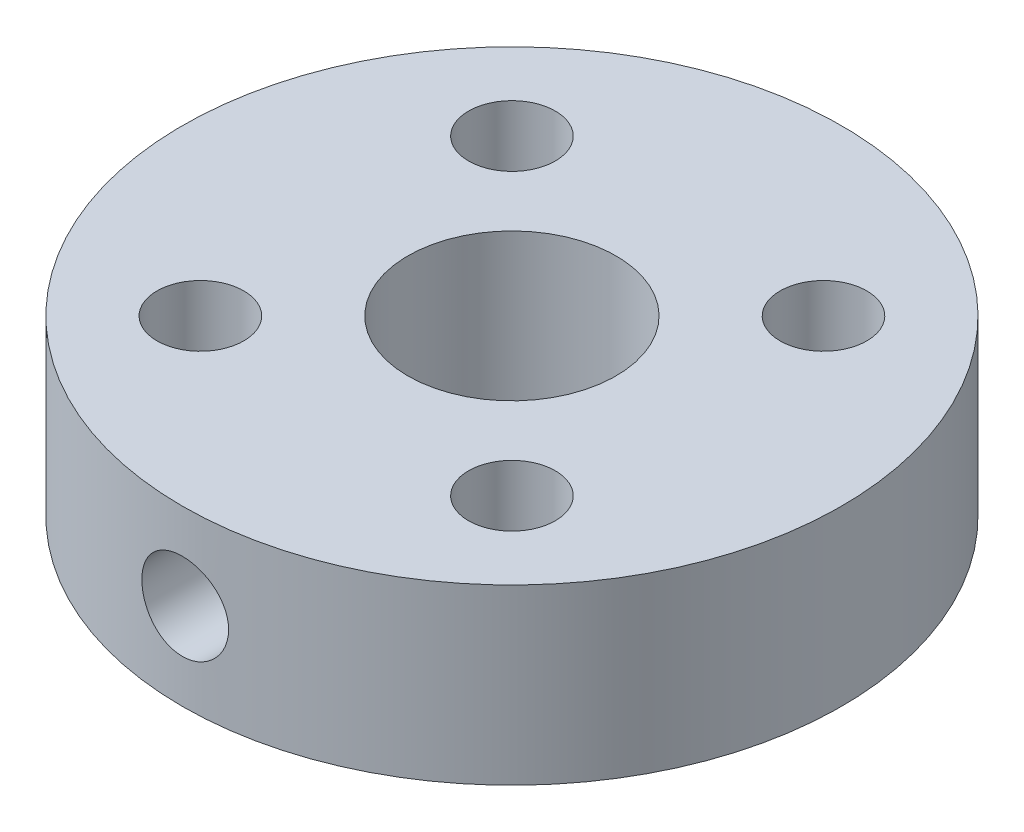
ISO-10303-21;
HEADER;
FILE_DESCRIPTION(('STEP AP214'),'2;1');
FILE_NAME('part.step','',(''),(''),'','','');
FILE_SCHEMA(('AUTOMOTIVE_DESIGN { 1 0 10303 214 1 1 1 1 }'));
ENDSEC;
DATA;
#1=APPLICATION_CONTEXT('core data for automotive mechanical design processes');
#2=APPLICATION_PROTOCOL_DEFINITION('international standard','automotive_design',2000,#1);
#3=PRODUCT_CONTEXT('',#1,'mechanical');
#4=PRODUCT('Part','Part','',(#3));
#5=PRODUCT_RELATED_PRODUCT_CATEGORY('part','',(#4));
#6=PRODUCT_DEFINITION_FORMATION('','',#4);
#7=PRODUCT_DEFINITION_CONTEXT('part definition',#1,'design');
#8=PRODUCT_DEFINITION('design','',#6,#7);
#9=PRODUCT_DEFINITION_SHAPE('','',#8);
#10=(LENGTH_UNIT() NAMED_UNIT(*) SI_UNIT(.MILLI.,.METRE.));
#11=(NAMED_UNIT(*) PLANE_ANGLE_UNIT() SI_UNIT($,.RADIAN.));
#12=(NAMED_UNIT(*) SI_UNIT($,.STERADIAN.) SOLID_ANGLE_UNIT());
#13=UNCERTAINTY_MEASURE_WITH_UNIT(LENGTH_MEASURE(1.E-05),#10,'distance_accuracy_value','');
#14=(GEOMETRIC_REPRESENTATION_CONTEXT(3) GLOBAL_UNCERTAINTY_ASSIGNED_CONTEXT((#13)) GLOBAL_UNIT_ASSIGNED_CONTEXT((#10,
#11,#12)) REPRESENTATION_CONTEXT('',''));
#15=CARTESIAN_POINT('',(0.,0.,0.));
#16=DIRECTION('',(0.,0.,1.));
#17=DIRECTION('',(1.,0.,0.));
#18=AXIS2_PLACEMENT_3D('',#15,#16,#17);
#19=CARTESIAN_POINT('',(0.,4.99999999999995,0.));
#20=DIRECTION('',(0.,-1.,0.));
#21=DIRECTION('',(0.,0.,-1.));
#22=AXIS2_PLACEMENT_3D('',#19,#20,#21);
#23=CYLINDRICAL_SURFACE('',#22,9.5);
#24=CARTESIAN_POINT('',(1.24999999999997,2.5,9.41740410091868));
#25=CARTESIAN_POINT('',(1.24999704789293,2.43011379465121,9.4174051504074));
#26=CARTESIAN_POINT('',(1.24411931466291,2.36018467255551,9.41819043981183));
#27=CARTESIAN_POINT('',(1.22076605843325,2.22227477521104,9.42124533027019));
#28=CARTESIAN_POINT('',(1.20327861458077,2.15429607758199,9.42351645694719));
#29=CARTESIAN_POINT('',(1.15723232174967,2.02230357984595,9.42928142888541));
#30=CARTESIAN_POINT('',(1.12868122804123,1.95828703876495,9.4327744174934));
#31=CARTESIAN_POINT('',(1.06133513403096,1.83596492220372,9.44058851379838));
#32=CARTESIAN_POINT('',(1.02254180069081,1.77765841950908,9.44490948670656));
#33=CARTESIAN_POINT('',(0.935555536447504,1.66803949801497,9.45392261518464));
#34=CARTESIAN_POINT('',(0.887311826136269,1.61676752761641,9.45861669074957));
#35=CARTESIAN_POINT('',(0.782903691497916,1.5230227732687,9.46782988877773));
#36=CARTESIAN_POINT('',(0.726738863459709,1.4805504380781,9.4723490023088));
#37=CARTESIAN_POINT('',(0.607827237142798,1.40546437122737,9.48072286825033));
#38=CARTESIAN_POINT('',(0.545057022732097,1.37288742035891,9.48457511969084));
#39=CARTESIAN_POINT('',(0.414877343359928,1.31875255294749,9.49116007065748));
#40=CARTESIAN_POINT('',(0.347468068548488,1.29719418506968,9.49389281603905));
#41=CARTESIAN_POINT('',(0.210338313470534,1.26582977739812,9.49791731953225));
#42=CARTESIAN_POINT('',(0.140633493799601,1.25595634411634,9.49921733795253));
#43=CARTESIAN_POINT('',(0.000545054460455096,1.24803311553231,9.50025814474572));
#44=CARTESIAN_POINT('',(-0.0698385356542585,1.24998280775381,9.49999900070091));
#45=CARTESIAN_POINT('',(-0.208827747812687,1.26559667926445,9.49795734365727));
#46=CARTESIAN_POINT('',(-0.27744167079201,1.27918837290116,9.49618425701231));
#47=CARTESIAN_POINT('',(-0.41140621434616,1.31758700356627,9.49132449458135));
#48=CARTESIAN_POINT('',(-0.476756767256604,1.34239417303495,9.48823779157078));
#49=CARTESIAN_POINT('',(-0.602562678419433,1.40259594273989,9.48108137373621));
#50=CARTESIAN_POINT('',(-0.663002955821257,1.43802170098401,9.47700877286315));
#51=CARTESIAN_POINT('',(-0.7771081440668,1.51843235628989,9.46833577460664));
#52=CARTESIAN_POINT('',(-0.83077271056404,1.56341773886713,9.4637353504215));
#53=CARTESIAN_POINT('',(-0.930229349088727,1.66207612684239,9.4544799980342));
#54=CARTESIAN_POINT('',(-0.975958735268566,1.71581233424793,9.44982492089108));
#55=CARTESIAN_POINT('',(-1.05775916328449,1.83023047618099,9.44101919770809));
#56=CARTESIAN_POINT('',(-1.09383016863951,1.89091243694236,9.43686855357356));
#57=CARTESIAN_POINT('',(-1.1552946873874,2.01755772705059,9.42954174057464));
#58=CARTESIAN_POINT('',(-1.18068283093794,2.08352369266976,9.4263660620023));
#59=CARTESIAN_POINT('',(-1.22000353371595,2.21883386407501,9.42135807082555));
#60=CARTESIAN_POINT('',(-1.2339367069745,2.28817788857288,9.4195256862159));
#61=CARTESIAN_POINT('',(-1.24986821658869,2.42772111469766,9.41742505133735));
#62=CARTESIAN_POINT('',(-1.25195492887764,2.49791005866257,9.41714521920935));
#63=CARTESIAN_POINT('',(-1.24436778967104,2.63763655644794,9.41815071410228));
#64=CARTESIAN_POINT('',(-1.23469421668084,2.70717412565486,9.41943600405822));
#65=CARTESIAN_POINT('',(-1.20393565087217,2.84335692266045,9.42341633828862));
#66=CARTESIAN_POINT('',(-1.18289375457393,2.91001205346493,9.42610605718739));
#67=CARTESIAN_POINT('',(-1.13004032110585,3.03884829537367,9.43258785218585));
#68=CARTESIAN_POINT('',(-1.0982283671149,3.10102923320545,9.43637997094963));
#69=CARTESIAN_POINT('',(-1.02452177647133,3.21955093973825,9.44466692307175));
#70=CARTESIAN_POINT('',(-0.982569368171561,3.27585549888499,9.44916572917079));
#71=CARTESIAN_POINT('',(-0.889854075114594,3.38065603112867,9.45834681086386));
#72=CARTESIAN_POINT('',(-0.839090809792224,3.42915166676221,9.46302909437602));
#73=CARTESIAN_POINT('',(-0.729807943556192,3.51726989431149,9.47208528996798));
#74=CARTESIAN_POINT('',(-0.67124121478615,3.5568342909582,9.47645705911993));
#75=CARTESIAN_POINT('',(-0.548242056186316,3.62556359939892,9.48436730464791));
#76=CARTESIAN_POINT('',(-0.483809755416936,3.6547287399388,9.48790579935238));
#77=CARTESIAN_POINT('',(-0.35109893942851,3.70173630666023,9.49374132443193));
#78=CARTESIAN_POINT('',(-0.282832344858814,3.71961191690486,9.49604199025898));
#79=CARTESIAN_POINT('',(-0.14423430770835,3.74364082577533,9.4991577737557));
#80=CARTESIAN_POINT('',(-0.0739029690011937,3.74979471307758,9.49997296602722));
#81=CARTESIAN_POINT('',(0.066260830819126,3.75019366185723,9.50002550419149));
#82=CARTESIAN_POINT('',(0.13609304940111,3.74452828407519,9.49927471634215));
#83=CARTESIAN_POINT('',(0.27380344128299,3.72163976918609,9.49630331821971));
#84=CARTESIAN_POINT('',(0.341681617009771,3.70441664643419,9.49408270977216));
#85=CARTESIAN_POINT('',(0.47354217356194,3.6589305925219,9.48842002745296));
#86=CARTESIAN_POINT('',(0.537526223211778,3.63067242947679,9.48497848119334));
#87=CARTESIAN_POINT('',(0.659858449122134,3.56392774970731,9.47725424463945));
#88=CARTESIAN_POINT('',(0.718206529238103,3.5254410585355,9.47297153999955));
#89=CARTESIAN_POINT('',(0.828067366506119,3.43900219469077,9.4640038592627));
#90=CARTESIAN_POINT('',(0.879527552763514,3.39098348067509,9.45931619411571));
#91=CARTESIAN_POINT('',(0.97369387772788,3.28698264817584,9.45008808874876));
#92=CARTESIAN_POINT('',(1.01639794604753,3.23099865158671,9.44554768356161));
#93=CARTESIAN_POINT('',(1.09199840888496,3.11237952083108,9.43710744957154));
#94=CARTESIAN_POINT('',(1.12485205925331,3.04971695441196,9.43321044460906));
#95=CARTESIAN_POINT('',(1.17952229042328,2.91974623395632,9.42653130552801));
#96=CARTESIAN_POINT('',(1.20135074085925,2.85244316497745,9.42374797311327));
#97=CARTESIAN_POINT('',(1.22819129159689,2.73733543112768,9.42027915781916));
#98=CARTESIAN_POINT('',(1.23635761509655,2.69025340647351,9.41920646480161));
#99=CARTESIAN_POINT('',(1.24726295373753,2.5954542589192,9.41776858101804));
#100=CARTESIAN_POINT('',(1.25000201649452,2.54773714159469,9.41740338404485));
#101=CARTESIAN_POINT('',(1.24999999999997,2.5,9.41740410091868));
#102=B_SPLINE_CURVE_WITH_KNOTS('',3,(#24,#25,#26,#27,#28,#29,#30,#31,#32,#33,#34,#35,#36,#37,
#38,#39,#40,#41,#42,#43,#44,#45,#46,#47,#48,#49,#50,#51,#52,#53,#54,#55,#56,#57,#58,#59,#60,#61,
#62,#63,#64,#65,#66,#67,#68,#69,#70,#71,#72,#73,#74,#75,#76,#77,#78,#79,#80,#81,#82,#83,#84,#85,
#86,#87,#88,#89,#90,#91,#92,#93,#94,#95,#96,#97,#98,#99,#100,#101),.UNSPECIFIED.,.T.,.F.,(4,2,2,
2,2,2,2,2,2,2,2,2,2,2,2,2,2,2,2,2,2,2,2,2,2,2,2,2,2,2,2,2,2,2,2,2,2,2,4),(0.,0.209484202571708,
0.419183836928668,0.628736743572624,0.838255565721981,1.04893269923852,1.25962057409923,
1.47108224647851,1.6825352564309,1.89276266234721,2.10298095597079,2.31189982011454,
2.5208230142917,2.73036535278689,2.93991833609106,3.15105801722767,3.36219849585722,
3.57344497984316,3.78468013945534,3.99433736908816,4.20398963374576,4.41285264161172,
4.62172373378562,4.831814068464,5.04191347978165,5.25334471898747,5.46477130718734,
5.67557350690561,5.88636511965182,6.09556525763878,6.30476513579171,6.51387472089913,
6.72298787259739,6.9336156757477,7.14429322463354,7.35587216352338,7.56722283023419,
7.71031637390369,7.85340866214722),.UNSPECIFIED.);
#103=CARTESIAN_POINT('',(1.24999999999997,2.5,9.41740410091868));
#104=VERTEX_POINT('',#103);
#105=EDGE_CURVE('E10',#104,#104,#102,.T.);
#106=ORIENTED_EDGE('',*,*,#105,.T.);
#107=EDGE_LOOP('',(#106));
#108=FACE_BOUND('',#107,.T.);
#109=CARTESIAN_POINT('',(0.,4.99999999999995,0.));
#110=DIRECTION('',(0.,1.,0.));
#111=DIRECTION('',(0.,0.,1.));
#112=AXIS2_PLACEMENT_3D('',#109,#110,#111);
#113=CIRCLE('',#112,9.5);
#114=CARTESIAN_POINT('',(0.,4.99999999999998,9.50000000000004));
#115=VERTEX_POINT('',#114);
#116=EDGE_CURVE('E60',#115,#115,#113,.T.);
#117=ORIENTED_EDGE('',*,*,#116,.F.);
#118=EDGE_LOOP('',(#117));
#119=FACE_BOUND('',#118,.T.);
#120=CARTESIAN_POINT('',(0.,0.,0.));
#121=DIRECTION('',(0.,1.,0.));
#122=DIRECTION('',(0.,0.,1.));
#123=AXIS2_PLACEMENT_3D('',#120,#121,#122);
#124=CIRCLE('',#123,9.5);
#125=CARTESIAN_POINT('',(0.,0.,9.50000000000001));
#126=VERTEX_POINT('',#125);
#127=EDGE_CURVE('E64',#126,#126,#124,.T.);
#128=ORIENTED_EDGE('',*,*,#127,.T.);
#129=EDGE_LOOP('',(#128));
#130=FACE_BOUND('',#129,.T.);
#131=ADVANCED_FACE('F49',(#108,#119,#130),#23,.T.);
#132=CARTESIAN_POINT('',(0.,4.99999999999995,0.));
#133=DIRECTION('',(0.,1.,0.));
#134=DIRECTION('',(0.,0.,1.));
#135=AXIS2_PLACEMENT_3D('',#132,#133,#134);
#136=PLANE('',#135);
#137=CARTESIAN_POINT('',(4.4901280605345,5.,-4.49012806053453));
#138=DIRECTION('',(0.,1.,0.));
#139=DIRECTION('',(0.,0.,1.));
#140=AXIS2_PLACEMENT_3D('',#137,#138,#139);
#141=CIRCLE('',#140,1.25);
#142=CARTESIAN_POINT('',(4.4901280605345,5.00000000000001,-3.24012806053453));
#143=VERTEX_POINT('',#142);
#144=EDGE_CURVE('E97',#143,#143,#141,.T.);
#145=ORIENTED_EDGE('',*,*,#144,.F.);
#146=EDGE_LOOP('',(#145));
#147=FACE_BOUND('',#146,.T.);
#148=CARTESIAN_POINT('',(-4.49012806053461,5.,-4.4901280605345));
#149=DIRECTION('',(0.,1.,0.));
#150=DIRECTION('',(0.,0.,1.));
#151=AXIS2_PLACEMENT_3D('',#148,#149,#150);
#152=CIRCLE('',#151,1.25);
#153=CARTESIAN_POINT('',(-4.49012806053462,5.00000000000001,-3.2401280605345));
#154=VERTEX_POINT('',#153);
#155=EDGE_CURVE('E91',#154,#154,#152,.T.);
#156=ORIENTED_EDGE('',*,*,#155,.F.);
#157=EDGE_LOOP('',(#156));
#158=FACE_BOUND('',#157,.T.);
#159=CARTESIAN_POINT('',(-4.49012806053461,5.,4.49012806053456));
#160=DIRECTION('',(0.,1.,0.));
#161=DIRECTION('',(0.,0.,1.));
#162=AXIS2_PLACEMENT_3D('',#159,#160,#161);
#163=CIRCLE('',#162,1.25);
#164=CARTESIAN_POINT('',(-4.49012806053462,5.00000000000001,5.74012806053456));
#165=VERTEX_POINT('',#164);
#166=EDGE_CURVE('E85',#165,#165,#163,.T.);
#167=ORIENTED_EDGE('',*,*,#166,.F.);
#168=EDGE_LOOP('',(#167));
#169=FACE_BOUND('',#168,.T.);
#170=CARTESIAN_POINT('',(4.49012806053461,5.00000000000006,4.49012806053453));
#171=DIRECTION('',(0.,1.,0.));
#172=DIRECTION('',(0.,0.,1.));
#173=AXIS2_PLACEMENT_3D('',#170,#171,#172);
#174=CIRCLE('',#173,1.25);
#175=CARTESIAN_POINT('',(4.49012806053461,5.00000000000006,5.74012806053453));
#176=VERTEX_POINT('',#175);
#177=EDGE_CURVE('E79',#176,#176,#174,.T.);
#178=ORIENTED_EDGE('',*,*,#177,.F.);
#179=EDGE_LOOP('',(#178));
#180=FACE_BOUND('',#179,.T.);
#181=CARTESIAN_POINT('',(0.,4.99999999999995,0.));
#182=DIRECTION('',(0.,1.,0.));
#183=DIRECTION('',(0.,0.,1.));
#184=AXIS2_PLACEMENT_3D('',#181,#182,#183);
#185=CIRCLE('',#184,2.99999999999999);
#186=CARTESIAN_POINT('',(0.,4.99999999999996,3.00000000000002));
#187=VERTEX_POINT('',#186);
#188=EDGE_CURVE('E73',#187,#187,#185,.T.);
#189=ORIENTED_EDGE('',*,*,#188,.F.);
#190=EDGE_LOOP('',(#189));
#191=FACE_BOUND('',#190,.T.);
#192=ORIENTED_EDGE('',*,*,#116,.T.);
#193=EDGE_LOOP('',(#192));
#194=FACE_BOUND('',#193,.T.);
#195=ADVANCED_FACE('F138',(#147,#158,#169,#180,#191,#194),#136,.T.);
#196=CARTESIAN_POINT('',(0.,0.,0.));
#197=DIRECTION('',(0.,1.,0.));
#198=DIRECTION('',(0.,0.,1.));
#199=AXIS2_PLACEMENT_3D('',#196,#197,#198);
#200=PLANE('',#199);
#201=CARTESIAN_POINT('',(4.4901280605345,0.,-4.49012806053461));
#202=DIRECTION('',(0.,1.,0.));
#203=DIRECTION('',(0.,0.,1.));
#204=AXIS2_PLACEMENT_3D('',#201,#202,#203);
#205=CIRCLE('',#204,1.25);
#206=CARTESIAN_POINT('',(4.4901280605345,0.,-3.24012806053462));
#207=VERTEX_POINT('',#206);
#208=EDGE_CURVE('E94',#207,#207,#205,.T.);
#209=ORIENTED_EDGE('',*,*,#208,.T.);
#210=EDGE_LOOP('',(#209));
#211=FACE_BOUND('',#210,.T.);
#212=CARTESIAN_POINT('',(-4.49012806053461,0.,-4.49012806053456));
#213=DIRECTION('',(0.,1.,0.));
#214=DIRECTION('',(0.,0.,1.));
#215=AXIS2_PLACEMENT_3D('',#212,#213,#214);
#216=CIRCLE('',#215,1.25);
#217=CARTESIAN_POINT('',(-4.49012806053462,0.,-3.24012806053456));
#218=VERTEX_POINT('',#217);
#219=EDGE_CURVE('E88',#218,#218,#216,.T.);
#220=ORIENTED_EDGE('',*,*,#219,.T.);
#221=EDGE_LOOP('',(#220));
#222=FACE_BOUND('',#221,.T.);
#223=CARTESIAN_POINT('',(-4.49012806053461,0.,4.49012806053456));
#224=DIRECTION('',(0.,1.,0.));
#225=DIRECTION('',(0.,0.,1.));
#226=AXIS2_PLACEMENT_3D('',#223,#224,#225);
#227=CIRCLE('',#226,1.25);
#228=CARTESIAN_POINT('',(-4.49012806053462,0.,5.74012806053456));
#229=VERTEX_POINT('',#228);
#230=EDGE_CURVE('E82',#229,#229,#227,.T.);
#231=ORIENTED_EDGE('',*,*,#230,.T.);
#232=EDGE_LOOP('',(#231));
#233=FACE_BOUND('',#232,.T.);
#234=CARTESIAN_POINT('',(4.49012806053461,0.,4.49012806053453));
#235=DIRECTION('',(0.,1.,0.));
#236=DIRECTION('',(0.,0.,1.));
#237=AXIS2_PLACEMENT_3D('',#234,#235,#236);
#238=CIRCLE('',#237,1.25);
#239=CARTESIAN_POINT('',(4.49012806053461,0.,5.74012806053453));
#240=VERTEX_POINT('',#239);
#241=EDGE_CURVE('E76',#240,#240,#238,.T.);
#242=ORIENTED_EDGE('',*,*,#241,.T.);
#243=EDGE_LOOP('',(#242));
#244=FACE_BOUND('',#243,.T.);
#245=CARTESIAN_POINT('',(0.,0.,0.));
#246=DIRECTION('',(0.,1.,0.));
#247=DIRECTION('',(0.,0.,1.));
#248=AXIS2_PLACEMENT_3D('',#245,#246,#247);
#249=CIRCLE('',#248,3.);
#250=CARTESIAN_POINT('',(0.,0.,3.));
#251=VERTEX_POINT('',#250);
#252=EDGE_CURVE('E69',#251,#251,#249,.T.);
#253=ORIENTED_EDGE('',*,*,#252,.T.);
#254=EDGE_LOOP('',(#253));
#255=FACE_BOUND('',#254,.T.);
#256=ORIENTED_EDGE('',*,*,#127,.F.);
#257=EDGE_LOOP('',(#256));
#258=FACE_BOUND('',#257,.T.);
#259=ADVANCED_FACE('F133',(#211,#222,#233,#244,#255,#258),#200,.F.);
#260=CARTESIAN_POINT('',(0.,4.99999999999995,0.));
#261=DIRECTION('',(0.,1.,0.));
#262=DIRECTION('',(0.,0.,1.));
#263=AXIS2_PLACEMENT_3D('',#260,#261,#262);
#264=CYLINDRICAL_SURFACE('',#263,2.99999999999999);
#265=CARTESIAN_POINT('',(0.,1.24999999999997,3.00000000000009));
#266=CARTESIAN_POINT('',(0.0669580526362388,1.2500072050913,2.99999458367283));
#267=CARTESIAN_POINT('',(0.134021397063767,1.25541195852825,2.99773232974712));
#268=CARTESIAN_POINT('',(0.266247371156246,1.27683906492027,2.98890153579553));
#269=CARTESIAN_POINT('',(0.331404576423481,1.29288912446421,2.98232175901036));
#270=CARTESIAN_POINT('',(0.457688733652974,1.33491109178055,2.96556289038138));
#271=CARTESIAN_POINT('',(0.518828524426104,1.36084938946823,2.95539599975008));
#272=CARTESIAN_POINT('',(0.635829756679693,1.42177282323265,2.93245286470667));
#273=CARTESIAN_POINT('',(0.691692790015936,1.45675521897082,2.91967741092856));
#274=CARTESIAN_POINT('',(0.799448403559497,1.53662898259082,2.89207828351877));
#275=CARTESIAN_POINT('',(0.851041267517629,1.58190130878982,2.87718753326099));
#276=CARTESIAN_POINT('',(0.946159821091127,1.68026433478265,2.84732714068518));
#277=CARTESIAN_POINT('',(0.989681263153082,1.73335912489447,2.83235746106815));
#278=CARTESIAN_POINT('',(1.06953737697065,1.84902677756482,2.80321021813003));
#279=CARTESIAN_POINT('',(1.1054130815391,1.91193744842655,2.78910786873393));
#280=CARTESIAN_POINT('',(1.16593940588851,2.04357325792096,2.76435572357011));
#281=CARTESIAN_POINT('',(1.19059580836292,2.11229537948442,2.75370415000826));
#282=CARTESIAN_POINT('',(1.22674598312161,2.25015369176786,2.73778555387708));
#283=CARTESIAN_POINT('',(1.23881657877595,2.31911048339213,2.73228387651794));
#284=CARTESIAN_POINT('',(1.25125209967782,2.45827329268657,2.7266132621951));
#285=CARTESIAN_POINT('',(1.25162348054393,2.52847860002574,2.72644138425263));
#286=CARTESIAN_POINT('',(1.24108450363674,2.66240006043493,2.73125119560855));
#287=CARTESIAN_POINT('',(1.23103681112297,2.72620109656445,2.73583882723627));
#288=CARTESIAN_POINT('',(1.20139191015763,2.85111209100037,2.74898482773802));
#289=CARTESIAN_POINT('',(1.18179287287157,2.91222153149173,2.75754395703568));
#290=CARTESIAN_POINT('',(1.13321958727553,3.0315577029914,2.7778618477276));
#291=CARTESIAN_POINT('',(1.10405471539227,3.08969542091337,2.7896848194914));
#292=CARTESIAN_POINT('',(1.03731242580561,3.20047773388014,2.81518331141089));
#293=CARTESIAN_POINT('',(0.999731690519535,3.25312015061348,2.82885956129783));
#294=CARTESIAN_POINT('',(0.913495965543833,3.35609995873281,2.85792976877982));
#295=CARTESIAN_POINT('',(0.864173483207527,3.40586656738544,2.87337121404473));
#296=CARTESIAN_POINT('',(0.757729591051486,3.49661350295918,2.90325673112533));
#297=CARTESIAN_POINT('',(0.7006063594484,3.53759177169215,2.91770056877018));
#298=CARTESIAN_POINT('',(0.578447948693304,3.61043582361627,2.94438283556482));
#299=CARTESIAN_POINT('',(0.513260582447625,3.64206944515077,2.95656266543339));
#300=CARTESIAN_POINT('',(0.377852402526755,3.69372113960331,2.97689481414803));
#301=CARTESIAN_POINT('',(0.30763439479492,3.71374563194376,2.98504935845798));
#302=CARTESIAN_POINT('',(0.168928113346089,3.7404159921266,2.99599641186383));
#303=CARTESIAN_POINT('',(0.100611285278511,3.74782785744383,2.99909541047126));
#304=CARTESIAN_POINT('',(-0.0363546554962009,3.75134622361418,3.00056050368748));
#305=CARTESIAN_POINT('',(-0.105003667152743,3.74745597025197,2.99892795711942));
#306=CARTESIAN_POINT('',(-0.237098242341557,3.72902891519391,2.99131217656941));
#307=CARTESIAN_POINT('',(-0.300632966639528,3.71503004590289,2.98554887283989));
#308=CARTESIAN_POINT('',(-0.424382748971206,3.67753180545929,2.97048606772416));
#309=CARTESIAN_POINT('',(-0.484597386518432,3.65403123404965,2.96118611959709));
#310=CARTESIAN_POINT('',(-0.602108999869216,3.59742902428783,2.93958270645171));
#311=CARTESIAN_POINT('',(-0.659257236855458,3.56405181685404,2.92719491469282));
#312=CARTESIAN_POINT('',(-0.767346216231523,3.48894662220839,2.90073804579087));
#313=CARTESIAN_POINT('',(-0.81828435260194,3.4472151484707,2.88666826768731));
#314=CARTESIAN_POINT('',(-0.916333430274267,3.35309676672754,2.85712087895435));
#315=CARTESIAN_POINT('',(-0.96291069797995,3.30016149701378,2.84161451591024));
#316=CARTESIAN_POINT('',(-1.04666984610566,3.18697872406467,2.81184336768004));
#317=CARTESIAN_POINT('',(-1.08384959285624,3.12672956482825,2.79757886493444));
#318=CARTESIAN_POINT('',(-1.14815960208704,2.99938582469737,2.77181386243992));
#319=CARTESIAN_POINT('',(-1.1751391823734,2.93220596448516,2.76035562555107));
#320=CARTESIAN_POINT('',(-1.21717413951587,2.79362940618991,2.74208355658953));
#321=CARTESIAN_POINT('',(-1.23223934863699,2.72223623751665,2.73526589555756));
#322=CARTESIAN_POINT('',(-1.24904080348909,2.58318130080076,2.72763164537268));
#323=CARTESIAN_POINT('',(-1.25171380413138,2.51565533770736,2.7263935096716));
#324=CARTESIAN_POINT('',(-1.24615575523923,2.38115713885887,2.7289385301102));
#325=CARTESIAN_POINT('',(-1.23792637964735,2.31418481968627,2.73272091540307));
#326=CARTESIAN_POINT('',(-1.21158404780504,2.18590725253107,2.74449551302269));
#327=CARTESIAN_POINT('',(-1.19394903571475,2.12448332653656,2.75228354846478));
#328=CARTESIAN_POINT('',(-1.14976328202136,2.00545197864274,2.7710318119919));
#329=CARTESIAN_POINT('',(-1.12321003517248,1.94784563460121,2.78199293131702));
#330=CARTESIAN_POINT('',(-1.06010285935483,1.83430410405088,2.80666954560023));
#331=CARTESIAN_POINT('',(-1.0230436091048,1.7786776698317,2.82051102713683));
#332=CARTESIAN_POINT('',(-0.940684072630435,1.67413986063928,2.84903689053838));
#333=CARTESIAN_POINT('',(-0.895380928905703,1.62523082439938,2.86372156345875));
#334=CARTESIAN_POINT('',(-0.793902045778904,1.53185131831524,2.89356392850107));
#335=CARTESIAN_POINT('',(-0.737174739949062,1.4879635671594,2.90867817511792));
#336=CARTESIAN_POINT('',(-0.616600079253208,1.41030054645642,2.93660143622021));
#337=CARTESIAN_POINT('',(-0.552749497945779,1.37652988511042,2.94940939916743));
#338=CARTESIAN_POINT('',(-0.420732056717968,1.32079015456011,2.97109183362464));
#339=CARTESIAN_POINT('',(-0.352653990980615,1.29863523338277,2.98002782581966));
#340=CARTESIAN_POINT('',(-0.21341042184651,1.26629367092223,2.99321009768625));
#341=CARTESIAN_POINT('',(-0.14225531698092,1.2560695574701,2.99747105811967));
#342=CARTESIAN_POINT('',(-0.0472360819191543,1.25066683891351,2.9997228756894));
#343=CARTESIAN_POINT('',(-0.0236245946756415,1.24999745785074,3.00000191102544));
#344=CARTESIAN_POINT('',(0.,1.24999999999997,3.00000000000009));
#345=B_SPLINE_CURVE_WITH_KNOTS('',3,(#265,#266,#267,#268,#269,#270,#271,#272,#273,#274,#275,
#276,#277,#278,#279,#280,#281,#282,#283,#284,#285,#286,#287,#288,#289,#290,#291,#292,#293,#294,
#295,#296,#297,#298,#299,#300,#301,#302,#303,#304,#305,#306,#307,#308,#309,#310,#311,#312,#313,
#314,#315,#316,#317,#318,#319,#320,#321,#322,#323,#324,#325,#326,#327,#328,#329,#330,#331,#332,
#333,#334,#335,#336,#337,#338,#339,#340,#341,#342,#343,#344),.UNSPECIFIED.,.T.,.F.,(4,2,2,2,2,2,
2,2,2,2,2,2,2,2,2,2,2,2,2,2,2,2,2,2,2,2,2,2,2,2,2,2,2,2,2,2,2,2,2,4),(0.,0.200806918883863,
0.402138540628552,0.602791851906197,0.803384436852905,1.01317936288798,1.22308438131455,
1.44331724539114,1.66343646730577,1.87295273137548,2.08235338249036,2.27570157202547,
2.46908679727205,2.66658713058702,2.86416545717188,3.07844141127882,3.29276749314579,
3.51204055060806,3.73119224218293,3.93648443393247,4.14171767493168,4.33676589735717,
4.5318387660178,4.73297135272154,4.93418805469487,5.14978488029288,5.36543061240338,
5.58414788359519,5.80268447074577,6.00439877559642,6.20608211297535,6.39837649964763,
6.59072494950617,6.79463893397442,6.99862373425939,7.21746535004885,7.43640649428581,
7.65172855819387,7.86637250469326,7.93722256499098),.UNSPECIFIED.);
#346=CARTESIAN_POINT('',(0.,1.24999999999997,3.00000000000009));
#347=VERTEX_POINT('',#346);
#348=EDGE_CURVE('E100',#347,#347,#345,.T.);
#349=ORIENTED_EDGE('',*,*,#348,.T.);
#350=EDGE_LOOP('',(#349));
#351=FACE_BOUND('',#350,.T.);
#352=ORIENTED_EDGE('',*,*,#252,.F.);
#353=EDGE_LOOP('',(#352));
#354=FACE_BOUND('',#353,.T.);
#355=ORIENTED_EDGE('',*,*,#188,.T.);
#356=EDGE_LOOP('',(#355));
#357=FACE_BOUND('',#356,.T.);
#358=ADVANCED_FACE('F106',(#351,#354,#357),#264,.F.);
#359=CARTESIAN_POINT('',(4.49012806053461,5.00000000000006,4.49012806053453));
#360=DIRECTION('',(0.,1.,0.));
#361=DIRECTION('',(0.,0.,1.));
#362=AXIS2_PLACEMENT_3D('',#359,#360,#361);
#363=CYLINDRICAL_SURFACE('',#362,1.25);
#364=ORIENTED_EDGE('',*,*,#241,.F.);
#365=EDGE_LOOP('',(#364));
#366=FACE_BOUND('',#365,.T.);
#367=ORIENTED_EDGE('',*,*,#177,.T.);
#368=EDGE_LOOP('',(#367));
#369=FACE_BOUND('',#368,.T.);
#370=ADVANCED_FACE('F126',(#366,#369),#363,.F.);
#371=CARTESIAN_POINT('',(-4.49012806053461,5.,4.49012806053456));
#372=DIRECTION('',(0.,1.,0.));
#373=DIRECTION('',(0.,0.,1.));
#374=AXIS2_PLACEMENT_3D('',#371,#372,#373);
#375=CYLINDRICAL_SURFACE('',#374,1.25);
#376=ORIENTED_EDGE('',*,*,#230,.F.);
#377=EDGE_LOOP('',(#376));
#378=FACE_BOUND('',#377,.T.);
#379=ORIENTED_EDGE('',*,*,#166,.T.);
#380=EDGE_LOOP('',(#379));
#381=FACE_BOUND('',#380,.T.);
#382=ADVANCED_FACE('F123',(#378,#381),#375,.F.);
#383=CARTESIAN_POINT('',(-4.49012806053461,5.,-4.4901280605345));
#384=DIRECTION('',(0.,1.,0.));
#385=DIRECTION('',(0.,0.,1.));
#386=AXIS2_PLACEMENT_3D('',#383,#384,#385);
#387=CYLINDRICAL_SURFACE('',#386,1.25);
#388=ORIENTED_EDGE('',*,*,#219,.F.);
#389=EDGE_LOOP('',(#388));
#390=FACE_BOUND('',#389,.T.);
#391=ORIENTED_EDGE('',*,*,#155,.T.);
#392=EDGE_LOOP('',(#391));
#393=FACE_BOUND('',#392,.T.);
#394=ADVANCED_FACE('F119',(#390,#393),#387,.F.);
#395=CARTESIAN_POINT('',(4.4901280605345,5.,-4.49012806053453));
#396=DIRECTION('',(0.,1.,0.));
#397=DIRECTION('',(0.,0.,1.));
#398=AXIS2_PLACEMENT_3D('',#395,#396,#397);
#399=CYLINDRICAL_SURFACE('',#398,1.25);
#400=ORIENTED_EDGE('',*,*,#208,.F.);
#401=EDGE_LOOP('',(#400));
#402=FACE_BOUND('',#401,.T.);
#403=ORIENTED_EDGE('',*,*,#144,.T.);
#404=EDGE_LOOP('',(#403));
#405=FACE_BOUND('',#404,.T.);
#406=ADVANCED_FACE('F114',(#402,#405),#399,.F.);
#407=CARTESIAN_POINT('',(-1.11022302462516E-13,2.50000000000011,9.50000000000004));
#408=DIRECTION('',(0.,0.,1.));
#409=DIRECTION('',(1.00000000000001,0.,0.));
#410=AXIS2_PLACEMENT_3D('',#407,#408,#409);
#411=CYLINDRICAL_SURFACE('',#410,1.24999999999999);
#412=ORIENTED_EDGE('',*,*,#105,.F.);
#413=EDGE_LOOP('',(#412));
#414=FACE_BOUND('',#413,.T.);
#415=ORIENTED_EDGE('',*,*,#348,.F.);
#416=EDGE_LOOP('',(#415));
#417=FACE_BOUND('',#416,.T.);
#418=ADVANCED_FACE('F110',(#414,#417),#411,.F.);
#419=CLOSED_SHELL('',(#131,#195,#259,#358,#370,#382,#394,#406,#418));
#420=MANIFOLD_SOLID_BREP('B2',#419);
#421=ADVANCED_BREP_SHAPE_REPRESENTATION('',(#18,#420),#14);
#422=SHAPE_DEFINITION_REPRESENTATION(#9,#421);
ENDSEC;
END-ISO-10303-21;
